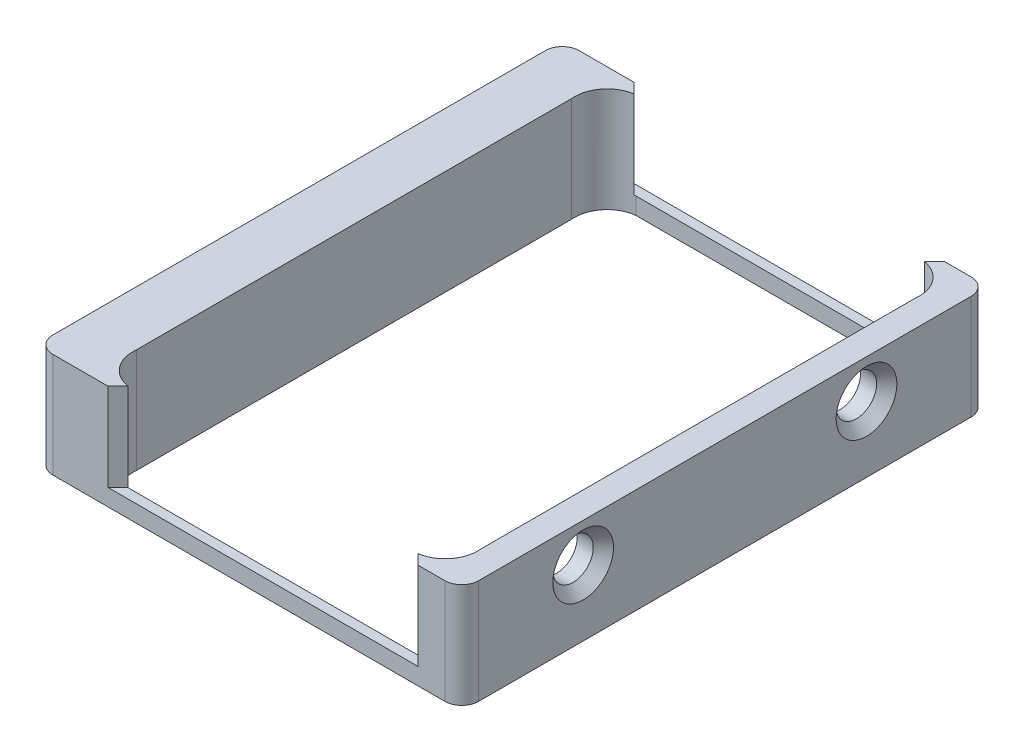
ISO-10303-21;
HEADER;
FILE_DESCRIPTION(('STEP AP214'),'2;1');
FILE_NAME('part.step','',(''),(''),'','','');
FILE_SCHEMA(('AUTOMOTIVE_DESIGN { 1 0 10303 214 1 1 1 1 }'));
ENDSEC;
DATA;
#1=APPLICATION_CONTEXT('core data for automotive mechanical design processes');
#2=APPLICATION_PROTOCOL_DEFINITION('international standard','automotive_design',2000,#1);
#3=PRODUCT_CONTEXT('',#1,'mechanical');
#4=PRODUCT('Part','Part','',(#3));
#5=PRODUCT_RELATED_PRODUCT_CATEGORY('part','',(#4));
#6=PRODUCT_DEFINITION_FORMATION('','',#4);
#7=PRODUCT_DEFINITION_CONTEXT('part definition',#1,'design');
#8=PRODUCT_DEFINITION('design','',#6,#7);
#9=PRODUCT_DEFINITION_SHAPE('','',#8);
#10=(LENGTH_UNIT() NAMED_UNIT(*) SI_UNIT(.MILLI.,.METRE.));
#11=(NAMED_UNIT(*) PLANE_ANGLE_UNIT() SI_UNIT($,.RADIAN.));
#12=(NAMED_UNIT(*) SI_UNIT($,.STERADIAN.) SOLID_ANGLE_UNIT());
#13=UNCERTAINTY_MEASURE_WITH_UNIT(LENGTH_MEASURE(1.E-05),#10,'distance_accuracy_value','');
#14=(GEOMETRIC_REPRESENTATION_CONTEXT(3) GLOBAL_UNCERTAINTY_ASSIGNED_CONTEXT((#13)) GLOBAL_UNIT_ASSIGNED_CONTEXT((#10,
#11,#12)) REPRESENTATION_CONTEXT('',''));
#15=CARTESIAN_POINT('',(0.,0.,0.));
#16=DIRECTION('',(0.,0.,1.));
#17=DIRECTION('',(1.,0.,0.));
#18=AXIS2_PLACEMENT_3D('',#15,#16,#17);
#19=CARTESIAN_POINT('',(0.,31.,0.));
#20=DIRECTION('',(0.,1.,0.));
#21=DIRECTION('',(0.,0.,1.));
#22=AXIS2_PLACEMENT_3D('',#19,#20,#21);
#23=PLANE('',#22);
#24=DIRECTION('',(-1.,0.,0.));
#25=VECTOR('',#24,1.);
#26=CARTESIAN_POINT('',(-67.3,31.,-78.));
#27=LINE('',#26,#25);
#28=CARTESIAN_POINT('',(-46.,31.,-78.));
#29=VERTEX_POINT('',#28);
#30=CARTESIAN_POINT('',(-62.3,31.,-78.));
#31=VERTEX_POINT('',#30);
#32=EDGE_CURVE('E371',#29,#31,#27,.T.);
#33=ORIENTED_EDGE('',*,*,#32,.T.);
#34=CARTESIAN_POINT('',(-62.3,31.,-73.));
#35=DIRECTION('',(0.,1.,0.));
#36=DIRECTION('',(0.,0.,1.));
#37=AXIS2_PLACEMENT_3D('',#34,#35,#36);
#38=CIRCLE('',#37,5.);
#39=CARTESIAN_POINT('',(-67.3,31.,-73.));
#40=VERTEX_POINT('',#39);
#41=EDGE_CURVE('E446',#31,#40,#38,.T.);
#42=ORIENTED_EDGE('',*,*,#41,.T.);
#43=DIRECTION('',(0.,0.,1.));
#44=VECTOR('',#43,1.);
#45=CARTESIAN_POINT('',(-67.3,31.,78.));
#46=LINE('',#45,#44);
#47=CARTESIAN_POINT('',(-67.3,31.,73.));
#48=VERTEX_POINT('',#47);
#49=EDGE_CURVE('E370',#40,#48,#46,.T.);
#50=ORIENTED_EDGE('',*,*,#49,.T.);
#51=CARTESIAN_POINT('',(-62.3,31.,73.));
#52=DIRECTION('',(0.,1.,0.));
#53=DIRECTION('',(0.,0.,1.));
#54=AXIS2_PLACEMENT_3D('',#51,#52,#53);
#55=CIRCLE('',#54,5.);
#56=CARTESIAN_POINT('',(-62.3,31.,78.));
#57=VERTEX_POINT('',#56);
#58=EDGE_CURVE('E443',#48,#57,#55,.T.);
#59=ORIENTED_EDGE('',*,*,#58,.T.);
#60=DIRECTION('',(1.,0.,0.));
#61=VECTOR('',#60,1.);
#62=CARTESIAN_POINT('',(-67.3,31.,78.));
#63=LINE('',#62,#61);
#64=CARTESIAN_POINT('',(-46.,31.,78.));
#65=VERTEX_POINT('',#64);
#66=EDGE_CURVE('E376',#57,#65,#63,.T.);
#67=ORIENTED_EDGE('',*,*,#66,.T.);
#68=DIRECTION('',(0.707106781186555,0.,-0.70710678118654));
#69=VECTOR('',#68,1.);
#70=CARTESIAN_POINT('',(16.0000000000005,31.,16.0000000000008));
#71=LINE('',#70,#69);
#72=CARTESIAN_POINT('',(-43.0299186250794,31.,75.0299186250794));
#73=VERTEX_POINT('',#72);
#74=EDGE_CURVE('E219',#65,#73,#71,.T.);
#75=ORIENTED_EDGE('',*,*,#74,.T.);
#76=CARTESIAN_POINT('',(-41.5,31.,65.5));
#77=DIRECTION('',(0.,1.,0.));
#78=DIRECTION('',(0.,0.,1.));
#79=AXIS2_PLACEMENT_3D('',#76,#77,#78);
#80=CIRCLE('',#79,9.65194280961093);
#81=CARTESIAN_POINT('',(-51.1,31.,64.5));
#82=VERTEX_POINT('',#81);
#83=EDGE_CURVE('E291',#82,#73,#80,.T.);
#84=ORIENTED_EDGE('',*,*,#83,.F.);
#85=DIRECTION('',(0.,0.,1.));
#86=VECTOR('',#85,1.);
#87=CARTESIAN_POINT('',(-51.1,31.,64.5));
#88=LINE('',#87,#86);
#89=CARTESIAN_POINT('',(-51.1,31.,-64.5));
#90=VERTEX_POINT('',#89);
#91=EDGE_CURVE('E309',#90,#82,#88,.T.);
#92=ORIENTED_EDGE('',*,*,#91,.F.);
#93=CARTESIAN_POINT('',(-41.5,31.,-65.5));
#94=DIRECTION('',(0.,1.,0.));
#95=DIRECTION('',(0.,0.,-1.));
#96=AXIS2_PLACEMENT_3D('',#93,#94,#95);
#97=CIRCLE('',#96,9.65194280961091);
#98=CARTESIAN_POINT('',(-43.0299186250794,31.,-75.0299186250794));
#99=VERTEX_POINT('',#98);
#100=EDGE_CURVE('E306',#99,#90,#97,.T.);
#101=ORIENTED_EDGE('',*,*,#100,.F.);
#102=DIRECTION('',(-0.707106781186549,0.,-0.707106781186546));
#103=VECTOR('',#102,1.);
#104=CARTESIAN_POINT('',(16.0000000000001,31.,-16.0000000000002));
#105=LINE('',#104,#103);
#106=EDGE_CURVE('E261',#99,#29,#105,.T.);
#107=ORIENTED_EDGE('',*,*,#106,.T.);
#108=EDGE_LOOP('',(#33,#42,#50,#59,#67,#75,#84,#92,#101,#107));
#109=FACE_BOUND('',#108,.T.);
#110=ADVANCED_FACE('F45',(#109),#23,.T.);
#111=DIRECTION('',(0.,0.,-1.));
#112=VECTOR('',#111,1.);
#113=CARTESIAN_POINT('',(58.9,31.,78.));
#114=LINE('',#113,#112);
#115=CARTESIAN_POINT('',(58.9,31.,73.));
#116=VERTEX_POINT('',#115);
#117=CARTESIAN_POINT('',(58.9,31.,-73.));
#118=VERTEX_POINT('',#117);
#119=EDGE_CURVE('E379',#116,#118,#114,.T.);
#120=ORIENTED_EDGE('',*,*,#119,.T.);
#121=CARTESIAN_POINT('',(53.9,31.,-73.));
#122=DIRECTION('',(0.,1.,0.));
#123=DIRECTION('',(0.,0.,1.));
#124=AXIS2_PLACEMENT_3D('',#121,#122,#123);
#125=CIRCLE('',#124,5.);
#126=CARTESIAN_POINT('',(53.9,31.,-78.));
#127=VERTEX_POINT('',#126);
#128=EDGE_CURVE('E458',#118,#127,#125,.T.);
#129=ORIENTED_EDGE('',*,*,#128,.T.);
#130=CARTESIAN_POINT('',(46.,31.,-78.));
#131=VERTEX_POINT('',#130);
#132=EDGE_CURVE('E367',#127,#131,#27,.T.);
#133=ORIENTED_EDGE('',*,*,#132,.T.);
#134=DIRECTION('',(0.707106781186549,0.,-0.707106781186546));
#135=VECTOR('',#134,1.);
#136=CARTESIAN_POINT('',(-16.0000000000001,31.,-16.0000000000002));
#137=LINE('',#136,#135);
#138=CARTESIAN_POINT('',(43.0299186250794,31.,-75.0299186250794));
#139=VERTEX_POINT('',#138);
#140=EDGE_CURVE('E272',#139,#131,#137,.T.);
#141=ORIENTED_EDGE('',*,*,#140,.F.);
#142=CARTESIAN_POINT('',(41.5,31.,-65.5));
#143=DIRECTION('',(0.,1.,0.));
#144=DIRECTION('',(0.,0.,-1.));
#145=AXIS2_PLACEMENT_3D('',#142,#143,#144);
#146=CIRCLE('',#145,9.65194280961098);
#147=CARTESIAN_POINT('',(51.1,31.,-64.5));
#148=VERTEX_POINT('',#147);
#149=EDGE_CURVE('E302',#148,#139,#146,.T.);
#150=ORIENTED_EDGE('',*,*,#149,.F.);
#151=DIRECTION('',(0.,0.,-1.));
#152=VECTOR('',#151,1.);
#153=CARTESIAN_POINT('',(51.1,31.,64.5));
#154=LINE('',#153,#152);
#155=CARTESIAN_POINT('',(51.1,31.,64.5));
#156=VERTEX_POINT('',#155);
#157=EDGE_CURVE('E299',#156,#148,#154,.T.);
#158=ORIENTED_EDGE('',*,*,#157,.F.);
#159=CARTESIAN_POINT('',(41.5,31.,65.5));
#160=DIRECTION('',(0.,1.,0.));
#161=DIRECTION('',(0.,0.,1.));
#162=AXIS2_PLACEMENT_3D('',#159,#160,#161);
#163=CIRCLE('',#162,9.65194280961099);
#164=CARTESIAN_POINT('',(43.0299186250794,31.,75.0299186250794));
#165=VERTEX_POINT('',#164);
#166=EDGE_CURVE('E295',#165,#156,#163,.T.);
#167=ORIENTED_EDGE('',*,*,#166,.F.);
#168=DIRECTION('',(0.707106781186549,0.,0.707106781186546));
#169=VECTOR('',#168,1.);
#170=CARTESIAN_POINT('',(-16.0000000000001,31.,16.0000000000002));
#171=LINE('',#170,#169);
#172=CARTESIAN_POINT('',(46.,31.,78.));
#173=VERTEX_POINT('',#172);
#174=EDGE_CURVE('E234',#165,#173,#171,.T.);
#175=ORIENTED_EDGE('',*,*,#174,.T.);
#176=CARTESIAN_POINT('',(53.9,31.,78.));
#177=VERTEX_POINT('',#176);
#178=EDGE_CURVE('E375',#173,#177,#63,.T.);
#179=ORIENTED_EDGE('',*,*,#178,.T.);
#180=CARTESIAN_POINT('',(53.9,31.,73.));
#181=DIRECTION('',(0.,1.,0.));
#182=DIRECTION('',(0.,0.,1.));
#183=AXIS2_PLACEMENT_3D('',#180,#181,#182);
#184=CIRCLE('',#183,5.);
#185=EDGE_CURVE('E455',#177,#116,#184,.T.);
#186=ORIENTED_EDGE('',*,*,#185,.T.);
#187=EDGE_LOOP('',(#120,#129,#133,#141,#150,#158,#167,#175,#179,#186));
#188=FACE_BOUND('',#187,.T.);
#189=ADVANCED_FACE('F633',(#188),#23,.T.);
#190=CARTESIAN_POINT('',(-67.3,31.,-78.));
#191=DIRECTION('',(0.,0.,1.));
#192=DIRECTION('',(1.,0.,0.));
#193=AXIS2_PLACEMENT_3D('',#190,#191,#192);
#194=PLANE('',#193);
#195=DIRECTION('',(-1.,0.,0.));
#196=VECTOR('',#195,1.);
#197=CARTESIAN_POINT('',(-67.3,0.,-78.));
#198=LINE('',#197,#196);
#199=CARTESIAN_POINT('',(53.9,0.,-78.));
#200=VERTEX_POINT('',#199);
#201=CARTESIAN_POINT('',(-62.3,0.,-78.));
#202=VERTEX_POINT('',#201);
#203=EDGE_CURVE('E366',#200,#202,#198,.T.);
#204=ORIENTED_EDGE('',*,*,#203,.T.);
#205=DIRECTION('',(0.,-1.,0.));
#206=VECTOR('',#205,1.);
#207=CARTESIAN_POINT('',(-62.3,31.,-78.));
#208=LINE('',#207,#206);
#209=EDGE_CURVE('E440',#202,#31,#208,.F.);
#210=ORIENTED_EDGE('',*,*,#209,.T.);
#211=ORIENTED_EDGE('',*,*,#32,.F.);
#212=DIRECTION('',(0.,1.,0.));
#213=VECTOR('',#212,1.);
#214=CARTESIAN_POINT('',(-46.,5.,-78.));
#215=LINE('',#214,#213);
#216=CARTESIAN_POINT('',(-46.,5.,-78.));
#217=VERTEX_POINT('',#216);
#218=EDGE_CURVE('E251',#217,#29,#215,.T.);
#219=ORIENTED_EDGE('',*,*,#218,.F.);
#220=DIRECTION('',(-1.,0.,0.));
#221=VECTOR('',#220,1.);
#222=CARTESIAN_POINT('',(0.,5.,-78.));
#223=LINE('',#222,#221);
#224=CARTESIAN_POINT('',(46.,5.,-78.));
#225=VERTEX_POINT('',#224);
#226=EDGE_CURVE('E264',#225,#217,#223,.T.);
#227=ORIENTED_EDGE('',*,*,#226,.F.);
#228=DIRECTION('',(0.,1.,0.));
#229=VECTOR('',#228,1.);
#230=CARTESIAN_POINT('',(46.,5.,-78.));
#231=LINE('',#230,#229);
#232=EDGE_CURVE('E271',#225,#131,#231,.T.);
#233=ORIENTED_EDGE('',*,*,#232,.T.);
#234=ORIENTED_EDGE('',*,*,#132,.F.);
#235=DIRECTION('',(0.,-1.,0.));
#236=VECTOR('',#235,1.);
#237=CARTESIAN_POINT('',(53.9,31.,-78.));
#238=LINE('',#237,#236);
#239=EDGE_CURVE('E436',#127,#200,#238,.T.);
#240=ORIENTED_EDGE('',*,*,#239,.T.);
#241=EDGE_LOOP('',(#204,#210,#211,#219,#227,#233,#234,#240));
#242=FACE_BOUND('',#241,.T.);
#243=ADVANCED_FACE('F610',(#242),#194,.F.);
#244=CARTESIAN_POINT('',(-67.3,31.,78.));
#245=DIRECTION('',(0.,0.,-1.));
#246=DIRECTION('',(-1.,0.,0.));
#247=AXIS2_PLACEMENT_3D('',#244,#245,#246);
#248=PLANE('',#247);
#249=DIRECTION('',(1.,0.,0.));
#250=VECTOR('',#249,1.);
#251=CARTESIAN_POINT('',(-67.3,0.,78.));
#252=LINE('',#251,#250);
#253=CARTESIAN_POINT('',(-62.3,0.,78.));
#254=VERTEX_POINT('',#253);
#255=CARTESIAN_POINT('',(53.9,0.,78.));
#256=VERTEX_POINT('',#255);
#257=EDGE_CURVE('E390',#254,#256,#252,.T.);
#258=ORIENTED_EDGE('',*,*,#257,.T.);
#259=DIRECTION('',(0.,-1.,0.));
#260=VECTOR('',#259,1.);
#261=CARTESIAN_POINT('',(53.9,31.,78.));
#262=LINE('',#261,#260);
#263=EDGE_CURVE('E62',#256,#177,#262,.F.);
#264=ORIENTED_EDGE('',*,*,#263,.T.);
#265=ORIENTED_EDGE('',*,*,#178,.F.);
#266=DIRECTION('',(0.,1.,0.));
#267=VECTOR('',#266,1.);
#268=CARTESIAN_POINT('',(46.,5.,78.));
#269=LINE('',#268,#267);
#270=CARTESIAN_POINT('',(46.,5.,78.));
#271=VERTEX_POINT('',#270);
#272=EDGE_CURVE('E223',#271,#173,#269,.T.);
#273=ORIENTED_EDGE('',*,*,#272,.F.);
#274=DIRECTION('',(1.,0.,0.));
#275=VECTOR('',#274,1.);
#276=CARTESIAN_POINT('',(0.,5.,78.));
#277=LINE('',#276,#275);
#278=CARTESIAN_POINT('',(-46.,5.,78.));
#279=VERTEX_POINT('',#278);
#280=EDGE_CURVE('E229',#279,#271,#277,.T.);
#281=ORIENTED_EDGE('',*,*,#280,.F.);
#282=DIRECTION('',(0.,1.,0.));
#283=VECTOR('',#282,1.);
#284=CARTESIAN_POINT('',(-46.,5.,78.));
#285=LINE('',#284,#283);
#286=EDGE_CURVE('E213',#279,#65,#285,.T.);
#287=ORIENTED_EDGE('',*,*,#286,.T.);
#288=ORIENTED_EDGE('',*,*,#66,.F.);
#289=DIRECTION('',(0.,-1.,0.));
#290=VECTOR('',#289,1.);
#291=CARTESIAN_POINT('',(-62.3,31.,78.));
#292=LINE('',#291,#290);
#293=EDGE_CURVE('E461',#57,#254,#292,.T.);
#294=ORIENTED_EDGE('',*,*,#293,.T.);
#295=EDGE_LOOP('',(#258,#264,#265,#273,#281,#287,#288,#294));
#296=FACE_BOUND('',#295,.T.);
#297=ADVANCED_FACE('F236',(#296),#248,.F.);
#298=CARTESIAN_POINT('',(-41.5,31.,65.5));
#299=DIRECTION('',(0.,-1.,0.));
#300=DIRECTION('',(0.,0.,-1.));
#301=AXIS2_PLACEMENT_3D('',#298,#299,#300);
#302=CYLINDRICAL_SURFACE('',#301,9.65194280961093);
#303=ORIENTED_EDGE('',*,*,#83,.T.);
#304=DIRECTION('',(0.,-1.,0.));
#305=VECTOR('',#304,1.);
#306=CARTESIAN_POINT('',(-43.0299186250794,31.,75.0299186250794));
#307=LINE('',#306,#305);
#308=CARTESIAN_POINT('',(-43.0299186250794,5.,75.0299186250794));
#309=VERTEX_POINT('',#308);
#310=EDGE_CURVE('E414',#73,#309,#307,.T.);
#311=ORIENTED_EDGE('',*,*,#310,.T.);
#312=CARTESIAN_POINT('',(-41.5,5.,65.5));
#313=DIRECTION('',(0.,1.,0.));
#314=DIRECTION('',(0.,0.,1.));
#315=AXIS2_PLACEMENT_3D('',#312,#313,#314);
#316=CIRCLE('',#315,9.65194280961093);
#317=CARTESIAN_POINT('',(-42.5,5.,75.1));
#318=VERTEX_POINT('',#317);
#319=EDGE_CURVE('E232',#309,#318,#316,.T.);
#320=ORIENTED_EDGE('',*,*,#319,.T.);
#321=DIRECTION('',(0.,-1.,0.));
#322=VECTOR('',#321,1.);
#323=CARTESIAN_POINT('',(-42.5,31.,75.1));
#324=LINE('',#323,#322);
#325=CARTESIAN_POINT('',(-42.5,0.,75.1));
#326=VERTEX_POINT('',#325);
#327=EDGE_CURVE('E363',#318,#326,#324,.T.);
#328=ORIENTED_EDGE('',*,*,#327,.T.);
#329=CARTESIAN_POINT('',(-41.5,0.,65.5));
#330=DIRECTION('',(0.,1.,0.));
#331=DIRECTION('',(0.,0.,1.));
#332=AXIS2_PLACEMENT_3D('',#329,#330,#331);
#333=CIRCLE('',#332,9.65194280961093);
#334=CARTESIAN_POINT('',(-51.1,0.,64.5));
#335=VERTEX_POINT('',#334);
#336=EDGE_CURVE('E290',#335,#326,#333,.T.);
#337=ORIENTED_EDGE('',*,*,#336,.F.);
#338=DIRECTION('',(0.,-1.,0.));
#339=VECTOR('',#338,1.);
#340=CARTESIAN_POINT('',(-51.1,31.,64.5));
#341=LINE('',#340,#339);
#342=EDGE_CURVE('E311',#82,#335,#341,.T.);
#343=ORIENTED_EDGE('',*,*,#342,.F.);
#344=EDGE_LOOP('',(#303,#311,#320,#328,#337,#343));
#345=FACE_BOUND('',#344,.T.);
#346=ADVANCED_FACE('F568',(#345),#302,.F.);
#347=CARTESIAN_POINT('',(-42.5,31.,75.1));
#348=DIRECTION('',(0.,0.,-1.));
#349=DIRECTION('',(-1.,0.,0.));
#350=AXIS2_PLACEMENT_3D('',#347,#348,#349);
#351=PLANE('',#350);
#352=ORIENTED_EDGE('',*,*,#327,.F.);
#353=DIRECTION('',(1.,0.,0.));
#354=VECTOR('',#353,1.);
#355=CARTESIAN_POINT('',(0.,5.,75.1));
#356=LINE('',#355,#354);
#357=CARTESIAN_POINT('',(42.5,5.,75.1));
#358=VERTEX_POINT('',#357);
#359=EDGE_CURVE('E224',#318,#358,#356,.T.);
#360=ORIENTED_EDGE('',*,*,#359,.T.);
#361=DIRECTION('',(0.,-1.,0.));
#362=VECTOR('',#361,1.);
#363=CARTESIAN_POINT('',(42.5,31.,75.1));
#364=LINE('',#363,#362);
#365=CARTESIAN_POINT('',(42.5,0.,75.1));
#366=VERTEX_POINT('',#365);
#367=EDGE_CURVE('E360',#358,#366,#364,.T.);
#368=ORIENTED_EDGE('',*,*,#367,.T.);
#369=DIRECTION('',(1.,0.,0.));
#370=VECTOR('',#369,1.);
#371=CARTESIAN_POINT('',(-42.5,0.,75.1));
#372=LINE('',#371,#370);
#373=EDGE_CURVE('E315',#326,#366,#372,.T.);
#374=ORIENTED_EDGE('',*,*,#373,.F.);
#375=EDGE_LOOP('',(#352,#360,#368,#374));
#376=FACE_BOUND('',#375,.T.);
#377=ADVANCED_FACE('F579',(#376),#351,.T.);
#378=CARTESIAN_POINT('',(41.5,31.,65.5));
#379=DIRECTION('',(0.,-1.,0.));
#380=DIRECTION('',(0.,0.,-1.));
#381=AXIS2_PLACEMENT_3D('',#378,#379,#380);
#382=CYLINDRICAL_SURFACE('',#381,9.65194280961099);
#383=CARTESIAN_POINT('',(41.5,5.,65.5));
#384=DIRECTION('',(0.,1.,0.));
#385=DIRECTION('',(0.,0.,1.));
#386=AXIS2_PLACEMENT_3D('',#383,#384,#385);
#387=CIRCLE('',#386,9.65194280961099);
#388=CARTESIAN_POINT('',(43.0299186250794,5.,75.0299186250794));
#389=VERTEX_POINT('',#388);
#390=EDGE_CURVE('E406',#358,#389,#387,.T.);
#391=ORIENTED_EDGE('',*,*,#390,.T.);
#392=DIRECTION('',(0.,-1.,0.));
#393=VECTOR('',#392,1.);
#394=CARTESIAN_POINT('',(43.0299186250794,31.,75.0299186250794));
#395=LINE('',#394,#393);
#396=EDGE_CURVE('E410',#389,#165,#395,.F.);
#397=ORIENTED_EDGE('',*,*,#396,.T.);
#398=ORIENTED_EDGE('',*,*,#166,.T.);
#399=DIRECTION('',(0.,-1.,0.));
#400=VECTOR('',#399,1.);
#401=CARTESIAN_POINT('',(51.1,31.,64.5));
#402=LINE('',#401,#400);
#403=CARTESIAN_POINT('',(51.1,0.,64.5));
#404=VERTEX_POINT('',#403);
#405=EDGE_CURVE('E357',#156,#404,#402,.T.);
#406=ORIENTED_EDGE('',*,*,#405,.T.);
#407=CARTESIAN_POINT('',(41.5,0.,65.5));
#408=DIRECTION('',(0.,1.,0.));
#409=DIRECTION('',(0.,0.,1.));
#410=AXIS2_PLACEMENT_3D('',#407,#408,#409);
#411=CIRCLE('',#410,9.65194280961099);
#412=EDGE_CURVE('E319',#366,#404,#411,.T.);
#413=ORIENTED_EDGE('',*,*,#412,.F.);
#414=ORIENTED_EDGE('',*,*,#367,.F.);
#415=EDGE_LOOP('',(#391,#397,#398,#406,#413,#414));
#416=FACE_BOUND('',#415,.T.);
#417=ADVANCED_FACE('F583',(#416),#382,.F.);
#418=CARTESIAN_POINT('',(-42.5,31.,-75.1));
#419=DIRECTION('',(0.,0.,1.));
#420=DIRECTION('',(1.,0.,0.));
#421=AXIS2_PLACEMENT_3D('',#418,#419,#420);
#422=PLANE('',#421);
#423=DIRECTION('',(0.,-1.,0.));
#424=VECTOR('',#423,1.);
#425=CARTESIAN_POINT('',(42.5,31.,-75.1));
#426=LINE('',#425,#424);
#427=CARTESIAN_POINT('',(42.5,5.,-75.1));
#428=VERTEX_POINT('',#427);
#429=CARTESIAN_POINT('',(42.5,0.,-75.1));
#430=VERTEX_POINT('',#429);
#431=EDGE_CURVE('E351',#428,#430,#426,.T.);
#432=ORIENTED_EDGE('',*,*,#431,.F.);
#433=DIRECTION('',(1.,0.,0.));
#434=VECTOR('',#433,1.);
#435=CARTESIAN_POINT('',(0.,5.,-75.1));
#436=LINE('',#435,#434);
#437=CARTESIAN_POINT('',(-42.5,5.,-75.1));
#438=VERTEX_POINT('',#437);
#439=EDGE_CURVE('E258',#438,#428,#436,.T.);
#440=ORIENTED_EDGE('',*,*,#439,.F.);
#441=DIRECTION('',(0.,-1.,0.));
#442=VECTOR('',#441,1.);
#443=CARTESIAN_POINT('',(-42.5,31.,-75.1));
#444=LINE('',#443,#442);
#445=CARTESIAN_POINT('',(-42.5,0.,-75.1));
#446=VERTEX_POINT('',#445);
#447=EDGE_CURVE('E348',#438,#446,#444,.T.);
#448=ORIENTED_EDGE('',*,*,#447,.T.);
#449=DIRECTION('',(-1.,0.,0.));
#450=VECTOR('',#449,1.);
#451=CARTESIAN_POINT('',(-42.5,0.,-75.1));
#452=LINE('',#451,#450);
#453=EDGE_CURVE('E331',#430,#446,#452,.T.);
#454=ORIENTED_EDGE('',*,*,#453,.F.);
#455=EDGE_LOOP('',(#432,#440,#448,#454));
#456=FACE_BOUND('',#455,.T.);
#457=ADVANCED_FACE('F599',(#456),#422,.T.);
#458=CARTESIAN_POINT('',(-41.5,31.,-65.5));
#459=DIRECTION('',(0.,-1.,0.));
#460=DIRECTION('',(0.,0.,-1.));
#461=AXIS2_PLACEMENT_3D('',#458,#459,#460);
#462=CYLINDRICAL_SURFACE('',#461,9.65194280961091);
#463=CARTESIAN_POINT('',(-41.5,5.,-65.5));
#464=DIRECTION('',(0.,1.,0.));
#465=DIRECTION('',(0.,0.,1.));
#466=AXIS2_PLACEMENT_3D('',#463,#464,#465);
#467=CIRCLE('',#466,9.65194280961091);
#468=CARTESIAN_POINT('',(-43.0299186250794,5.,-75.0299186250794));
#469=VERTEX_POINT('',#468);
#470=EDGE_CURVE('E382',#438,#469,#467,.T.);
#471=ORIENTED_EDGE('',*,*,#470,.T.);
#472=DIRECTION('',(0.,-1.,0.));
#473=VECTOR('',#472,1.);
#474=CARTESIAN_POINT('',(-43.0299186250794,31.,-75.0299186250794));
#475=LINE('',#474,#473);
#476=EDGE_CURVE('E399',#469,#99,#475,.F.);
#477=ORIENTED_EDGE('',*,*,#476,.T.);
#478=ORIENTED_EDGE('',*,*,#100,.T.);
#479=DIRECTION('',(0.,-1.,0.));
#480=VECTOR('',#479,1.);
#481=CARTESIAN_POINT('',(-51.1,31.,-64.5));
#482=LINE('',#481,#480);
#483=CARTESIAN_POINT('',(-51.1,0.,-64.5));
#484=VERTEX_POINT('',#483);
#485=EDGE_CURVE('E345',#90,#484,#482,.T.);
#486=ORIENTED_EDGE('',*,*,#485,.T.);
#487=CARTESIAN_POINT('',(-41.5,0.,-65.5));
#488=DIRECTION('',(0.,1.,0.));
#489=DIRECTION('',(0.,0.,-1.));
#490=AXIS2_PLACEMENT_3D('',#487,#488,#489);
#491=CIRCLE('',#490,9.65194280961091);
#492=EDGE_CURVE('E335',#446,#484,#491,.T.);
#493=ORIENTED_EDGE('',*,*,#492,.F.);
#494=ORIENTED_EDGE('',*,*,#447,.F.);
#495=EDGE_LOOP('',(#471,#477,#478,#486,#493,#494));
#496=FACE_BOUND('',#495,.T.);
#497=ADVANCED_FACE('F557',(#496),#462,.F.);
#498=CARTESIAN_POINT('',(0.,0.,0.));
#499=DIRECTION('',(0.,1.,0.));
#500=DIRECTION('',(0.,0.,1.));
#501=AXIS2_PLACEMENT_3D('',#498,#499,#500);
#502=PLANE('',#501);
#503=CARTESIAN_POINT('',(53.7050082180734,0.,73.3482193616655));
#504=DIRECTION('',(0.,-1.,0.));
#505=DIRECTION('',(0.,0.,-1.));
#506=AXIS2_PLACEMENT_3D('',#503,#504,#505);
#507=CIRCLE('',#506,2.1);
#508=CARTESIAN_POINT('',(53.7050082180734,0.,71.2482193616655));
#509=VERTEX_POINT('',#508);
#510=EDGE_CURVE('E523',#509,#509,#507,.T.);
#511=ORIENTED_EDGE('',*,*,#510,.F.);
#512=EDGE_LOOP('',(#511));
#513=FACE_BOUND('',#512,.T.);
#514=CARTESIAN_POINT('',(-58.4934425788602,0.,-70.9643370582062));
#515=DIRECTION('',(0.,-1.,0.));
#516=DIRECTION('',(0.,0.,-1.));
#517=AXIS2_PLACEMENT_3D('',#514,#515,#516);
#518=CIRCLE('',#517,2.1);
#519=CARTESIAN_POINT('',(-58.4934425788602,0.,-73.0643370582062));
#520=VERTEX_POINT('',#519);
#521=EDGE_CURVE('E531',#520,#520,#518,.T.);
#522=ORIENTED_EDGE('',*,*,#521,.F.);
#523=EDGE_LOOP('',(#522));
#524=FACE_BOUND('',#523,.T.);
#525=CARTESIAN_POINT('',(53.7050082180734,0.,-73.3482193616655));
#526=DIRECTION('',(0.,-1.,0.));
#527=DIRECTION('',(0.,0.,-1.));
#528=AXIS2_PLACEMENT_3D('',#525,#526,#527);
#529=CIRCLE('',#528,2.1);
#530=CARTESIAN_POINT('',(53.7050082180734,0.,-75.4482193616655));
#531=VERTEX_POINT('',#530);
#532=EDGE_CURVE('E532',#531,#531,#529,.T.);
#533=ORIENTED_EDGE('',*,*,#532,.F.);
#534=EDGE_LOOP('',(#533));
#535=FACE_BOUND('',#534,.T.);
#536=CARTESIAN_POINT('',(-58.4934425788602,0.,70.9643370582062));
#537=DIRECTION('',(0.,-1.,0.));
#538=DIRECTION('',(0.,0.,-1.));
#539=AXIS2_PLACEMENT_3D('',#536,#537,#538);
#540=CIRCLE('',#539,2.1);
#541=CARTESIAN_POINT('',(-58.4934425788602,0.,68.8643370582062));
#542=VERTEX_POINT('',#541);
#543=EDGE_CURVE('E519',#542,#542,#540,.T.);
#544=ORIENTED_EDGE('',*,*,#543,.F.);
#545=EDGE_LOOP('',(#544));
#546=FACE_BOUND('',#545,.T.);
#547=DIRECTION('',(0.,0.,1.));
#548=VECTOR('',#547,1.);
#549=CARTESIAN_POINT('',(-67.3,0.,78.));
#550=LINE('',#549,#548);
#551=CARTESIAN_POINT('',(-67.3,0.,-73.));
#552=VERTEX_POINT('',#551);
#553=CARTESIAN_POINT('',(-67.3,0.,73.));
#554=VERTEX_POINT('',#553);
#555=EDGE_CURVE('E386',#552,#554,#550,.T.);
#556=ORIENTED_EDGE('',*,*,#555,.F.);
#557=CARTESIAN_POINT('',(-62.3,0.,-73.));
#558=DIRECTION('',(0.,1.,0.));
#559=DIRECTION('',(0.,0.,1.));
#560=AXIS2_PLACEMENT_3D('',#557,#558,#559);
#561=CIRCLE('',#560,5.);
#562=EDGE_CURVE('E433',#552,#202,#561,.F.);
#563=ORIENTED_EDGE('',*,*,#562,.T.);
#564=ORIENTED_EDGE('',*,*,#203,.F.);
#565=CARTESIAN_POINT('',(53.9,0.,-73.));
#566=DIRECTION('',(0.,1.,0.));
#567=DIRECTION('',(0.,0.,1.));
#568=AXIS2_PLACEMENT_3D('',#565,#566,#567);
#569=CIRCLE('',#568,5.);
#570=CARTESIAN_POINT('',(58.9,0.,-73.));
#571=VERTEX_POINT('',#570);
#572=EDGE_CURVE('E430',#200,#571,#569,.F.);
#573=ORIENTED_EDGE('',*,*,#572,.T.);
#574=DIRECTION('',(0.,0.,-1.));
#575=VECTOR('',#574,1.);
#576=CARTESIAN_POINT('',(58.9,0.,78.));
#577=LINE('',#576,#575);
#578=CARTESIAN_POINT('',(58.9,0.,73.));
#579=VERTEX_POINT('',#578);
#580=EDGE_CURVE('E393',#579,#571,#577,.T.);
#581=ORIENTED_EDGE('',*,*,#580,.F.);
#582=CARTESIAN_POINT('',(53.9,0.,73.));
#583=DIRECTION('',(0.,1.,0.));
#584=DIRECTION('',(0.,0.,1.));
#585=AXIS2_PLACEMENT_3D('',#582,#583,#584);
#586=CIRCLE('',#585,5.);
#587=EDGE_CURVE('E427',#579,#256,#586,.F.);
#588=ORIENTED_EDGE('',*,*,#587,.T.);
#589=ORIENTED_EDGE('',*,*,#257,.F.);
#590=CARTESIAN_POINT('',(-62.3,0.,73.));
#591=DIRECTION('',(0.,1.,0.));
#592=DIRECTION('',(0.,0.,1.));
#593=AXIS2_PLACEMENT_3D('',#590,#591,#592);
#594=CIRCLE('',#593,5.);
#595=EDGE_CURVE('E424',#254,#554,#594,.F.);
#596=ORIENTED_EDGE('',*,*,#595,.T.);
#597=EDGE_LOOP('',(#556,#563,#564,#573,#581,#588,#589,#596));
#598=FACE_BOUND('',#597,.T.);
#599=ORIENTED_EDGE('',*,*,#336,.T.);
#600=ORIENTED_EDGE('',*,*,#373,.T.);
#601=ORIENTED_EDGE('',*,*,#412,.T.);
#602=DIRECTION('',(0.,0.,-1.));
#603=VECTOR('',#602,1.);
#604=CARTESIAN_POINT('',(51.1,0.,64.5));
#605=LINE('',#604,#603);
#606=CARTESIAN_POINT('',(51.1,0.,-64.5));
#607=VERTEX_POINT('',#606);
#608=EDGE_CURVE('E323',#404,#607,#605,.T.);
#609=ORIENTED_EDGE('',*,*,#608,.T.);
#610=CARTESIAN_POINT('',(41.5,0.,-65.5));
#611=DIRECTION('',(0.,1.,0.));
#612=DIRECTION('',(0.,0.,-1.));
#613=AXIS2_PLACEMENT_3D('',#610,#611,#612);
#614=CIRCLE('',#613,9.65194280961098);
#615=EDGE_CURVE('E327',#607,#430,#614,.T.);
#616=ORIENTED_EDGE('',*,*,#615,.T.);
#617=ORIENTED_EDGE('',*,*,#453,.T.);
#618=ORIENTED_EDGE('',*,*,#492,.T.);
#619=DIRECTION('',(0.,0.,1.));
#620=VECTOR('',#619,1.);
#621=CARTESIAN_POINT('',(-51.1,0.,64.5));
#622=LINE('',#621,#620);
#623=EDGE_CURVE('E296',#484,#335,#622,.T.);
#624=ORIENTED_EDGE('',*,*,#623,.T.);
#625=EDGE_LOOP('',(#599,#600,#601,#609,#616,#617,#618,#624));
#626=FACE_BOUND('',#625,.T.);
#627=ADVANCED_FACE('F553',(#513,#524,#535,#546,#598,#626),#502,.F.);
#628=CARTESIAN_POINT('',(-67.3,31.,78.));
#629=DIRECTION('',(1.,0.,0.));
#630=DIRECTION('',(0.,0.,-1.));
#631=AXIS2_PLACEMENT_3D('',#628,#629,#630);
#632=PLANE('',#631);
#633=CARTESIAN_POINT('',(-67.3,13.95,-11.));
#634=DIRECTION('',(-1.,0.,0.));
#635=DIRECTION('',(0.,0.,1.));
#636=AXIS2_PLACEMENT_3D('',#633,#634,#635);
#637=CIRCLE('',#636,2.1);
#638=CARTESIAN_POINT('',(-67.3,13.95,-8.9));
#639=VERTEX_POINT('',#638);
#640=EDGE_CURVE('E504',#639,#639,#637,.T.);
#641=ORIENTED_EDGE('',*,*,#640,.F.);
#642=EDGE_LOOP('',(#641));
#643=FACE_BOUND('',#642,.T.);
#644=CARTESIAN_POINT('',(-67.3,13.95,11.));
#645=DIRECTION('',(-1.,0.,0.));
#646=DIRECTION('',(0.,0.,-1.));
#647=AXIS2_PLACEMENT_3D('',#644,#645,#646);
#648=CIRCLE('',#647,2.1);
#649=CARTESIAN_POINT('',(-67.3,13.95,8.9));
#650=VERTEX_POINT('',#649);
#651=EDGE_CURVE('E511',#650,#650,#648,.T.);
#652=ORIENTED_EDGE('',*,*,#651,.F.);
#653=EDGE_LOOP('',(#652));
#654=FACE_BOUND('',#653,.T.);
#655=ORIENTED_EDGE('',*,*,#49,.F.);
#656=DIRECTION('',(0.,-1.,0.));
#657=VECTOR('',#656,1.);
#658=CARTESIAN_POINT('',(-67.3,31.,-73.));
#659=LINE('',#658,#657);
#660=EDGE_CURVE('E420',#40,#552,#659,.T.);
#661=ORIENTED_EDGE('',*,*,#660,.T.);
#662=ORIENTED_EDGE('',*,*,#555,.T.);
#663=DIRECTION('',(0.,-1.,0.));
#664=VECTOR('',#663,1.);
#665=CARTESIAN_POINT('',(-67.3,31.,73.));
#666=LINE('',#665,#664);
#667=EDGE_CURVE('E417',#554,#48,#666,.F.);
#668=ORIENTED_EDGE('',*,*,#667,.T.);
#669=EDGE_LOOP('',(#655,#661,#662,#668));
#670=FACE_BOUND('',#669,.T.);
#671=ADVANCED_FACE('F556',(#643,#654,#670),#632,.F.);
#672=CARTESIAN_POINT('',(58.9,31.,78.));
#673=DIRECTION('',(-1.,0.,0.));
#674=DIRECTION('',(0.,0.,1.));
#675=AXIS2_PLACEMENT_3D('',#672,#673,#674);
#676=PLANE('',#675);
#677=CARTESIAN_POINT('',(58.9,19.55,-42.));
#678=DIRECTION('',(-1.,0.,0.));
#679=DIRECTION('',(0.,0.,1.));
#680=AXIS2_PLACEMENT_3D('',#677,#678,#679);
#681=CIRCLE('',#680,9.00000000000001);
#682=CARTESIAN_POINT('',(58.9,19.55,-33.));
#683=VERTEX_POINT('',#682);
#684=EDGE_CURVE('E55',#683,#683,#681,.T.);
#685=ORIENTED_EDGE('',*,*,#684,.T.);
#686=EDGE_LOOP('',(#685));
#687=FACE_BOUND('',#686,.T.);
#688=CARTESIAN_POINT('',(58.9,19.55,42.));
#689=DIRECTION('',(-1.,0.,0.));
#690=DIRECTION('',(0.,0.,1.));
#691=AXIS2_PLACEMENT_3D('',#688,#689,#690);
#692=CIRCLE('',#691,9.00000000000004);
#693=CARTESIAN_POINT('',(58.9,19.55,51.));
#694=VERTEX_POINT('',#693);
#695=EDGE_CURVE('E475',#694,#694,#692,.T.);
#696=ORIENTED_EDGE('',*,*,#695,.T.);
#697=EDGE_LOOP('',(#696));
#698=FACE_BOUND('',#697,.T.);
#699=ORIENTED_EDGE('',*,*,#580,.T.);
#700=DIRECTION('',(0.,-1.,0.));
#701=VECTOR('',#700,1.);
#702=CARTESIAN_POINT('',(58.9,31.,-73.));
#703=LINE('',#702,#701);
#704=EDGE_CURVE('E70',#571,#118,#703,.F.);
#705=ORIENTED_EDGE('',*,*,#704,.T.);
#706=ORIENTED_EDGE('',*,*,#119,.F.);
#707=DIRECTION('',(0.,-1.,0.));
#708=VECTOR('',#707,1.);
#709=CARTESIAN_POINT('',(58.9,31.,73.));
#710=LINE('',#709,#708);
#711=EDGE_CURVE('E449',#116,#579,#710,.T.);
#712=ORIENTED_EDGE('',*,*,#711,.T.);
#713=EDGE_LOOP('',(#699,#705,#706,#712));
#714=FACE_BOUND('',#713,.T.);
#715=ADVANCED_FACE('F482',(#687,#698,#714),#676,.F.);
#716=CARTESIAN_POINT('',(51.1,31.,64.5));
#717=DIRECTION('',(-1.,0.,0.));
#718=DIRECTION('',(0.,0.,1.));
#719=AXIS2_PLACEMENT_3D('',#716,#717,#718);
#720=PLANE('',#719);
#721=CARTESIAN_POINT('',(51.1,19.55,-42.));
#722=DIRECTION('',(-1.,0.,0.));
#723=DIRECTION('',(0.,0.,1.));
#724=AXIS2_PLACEMENT_3D('',#721,#722,#723);
#725=CIRCLE('',#724,6.);
#726=CARTESIAN_POINT('',(51.1,19.55,-36.));
#727=VERTEX_POINT('',#726);
#728=EDGE_CURVE('E471',#727,#727,#725,.T.);
#729=ORIENTED_EDGE('',*,*,#728,.F.);
#730=EDGE_LOOP('',(#729));
#731=FACE_BOUND('',#730,.T.);
#732=CARTESIAN_POINT('',(51.1,19.55,42.));
#733=DIRECTION('',(-1.,0.,0.));
#734=DIRECTION('',(0.,0.,1.));
#735=AXIS2_PLACEMENT_3D('',#732,#733,#734);
#736=CIRCLE('',#735,6.);
#737=CARTESIAN_POINT('',(51.1,19.55,48.));
#738=VERTEX_POINT('',#737);
#739=EDGE_CURVE('E276',#738,#738,#736,.T.);
#740=ORIENTED_EDGE('',*,*,#739,.F.);
#741=EDGE_LOOP('',(#740));
#742=FACE_BOUND('',#741,.T.);
#743=ORIENTED_EDGE('',*,*,#608,.F.);
#744=ORIENTED_EDGE('',*,*,#405,.F.);
#745=ORIENTED_EDGE('',*,*,#157,.T.);
#746=DIRECTION('',(0.,-1.,0.));
#747=VECTOR('',#746,1.);
#748=CARTESIAN_POINT('',(51.1,31.,-64.5));
#749=LINE('',#748,#747);
#750=EDGE_CURVE('E354',#148,#607,#749,.T.);
#751=ORIENTED_EDGE('',*,*,#750,.T.);
#752=EDGE_LOOP('',(#743,#744,#745,#751));
#753=FACE_BOUND('',#752,.T.);
#754=ADVANCED_FACE('F588',(#731,#742,#753),#720,.T.);
#755=CARTESIAN_POINT('',(41.5,31.,-65.5));
#756=DIRECTION('',(0.,-1.,0.));
#757=DIRECTION('',(0.,0.,-1.));
#758=AXIS2_PLACEMENT_3D('',#755,#756,#757);
#759=CYLINDRICAL_SURFACE('',#758,9.65194280961098);
#760=DIRECTION('',(0.,-1.,0.));
#761=VECTOR('',#760,1.);
#762=CARTESIAN_POINT('',(43.0299186250794,31.,-75.0299186250794));
#763=LINE('',#762,#761);
#764=CARTESIAN_POINT('',(43.0299186250794,5.,-75.0299186250794));
#765=VERTEX_POINT('',#764);
#766=EDGE_CURVE('E403',#765,#139,#763,.F.);
#767=ORIENTED_EDGE('',*,*,#766,.F.);
#768=CARTESIAN_POINT('',(41.5,5.,-65.5));
#769=DIRECTION('',(0.,1.,0.));
#770=DIRECTION('',(0.,0.,1.));
#771=AXIS2_PLACEMENT_3D('',#768,#769,#770);
#772=CIRCLE('',#771,9.65194280961098);
#773=EDGE_CURVE('E256',#765,#428,#772,.T.);
#774=ORIENTED_EDGE('',*,*,#773,.T.);
#775=ORIENTED_EDGE('',*,*,#431,.T.);
#776=ORIENTED_EDGE('',*,*,#615,.F.);
#777=ORIENTED_EDGE('',*,*,#750,.F.);
#778=ORIENTED_EDGE('',*,*,#149,.T.);
#779=EDGE_LOOP('',(#767,#774,#775,#776,#777,#778));
#780=FACE_BOUND('',#779,.T.);
#781=ADVANCED_FACE('F594',(#780),#759,.F.);
#782=CARTESIAN_POINT('',(-51.1,31.,64.5));
#783=DIRECTION('',(1.,0.,0.));
#784=DIRECTION('',(0.,0.,-1.));
#785=AXIS2_PLACEMENT_3D('',#782,#783,#784);
#786=PLANE('',#785);
#787=ORIENTED_EDGE('',*,*,#623,.F.);
#788=ORIENTED_EDGE('',*,*,#485,.F.);
#789=ORIENTED_EDGE('',*,*,#91,.T.);
#790=ORIENTED_EDGE('',*,*,#342,.T.);
#791=EDGE_LOOP('',(#787,#788,#789,#790));
#792=FACE_BOUND('',#791,.T.);
#793=ADVANCED_FACE('F572',(#792),#786,.T.);
#794=CARTESIAN_POINT('',(16.0000000000001,5.,-16.0000000000002));
#795=DIRECTION('',(0.707106781186546,0.,-0.707106781186549));
#796=DIRECTION('',(-0.707106781186549,0.,-0.707106781186546));
#797=AXIS2_PLACEMENT_3D('',#794,#795,#796);
#798=PLANE('',#797);
#799=DIRECTION('',(-0.707106781186549,0.,-0.707106781186546));
#800=VECTOR('',#799,1.);
#801=CARTESIAN_POINT('',(16.0000000000001,5.,-16.0000000000002));
#802=LINE('',#801,#800);
#803=EDGE_CURVE('E268',#469,#217,#802,.T.);
#804=ORIENTED_EDGE('',*,*,#803,.T.);
#805=ORIENTED_EDGE('',*,*,#218,.T.);
#806=ORIENTED_EDGE('',*,*,#106,.F.);
#807=ORIENTED_EDGE('',*,*,#476,.F.);
#808=EDGE_LOOP('',(#804,#805,#806,#807));
#809=FACE_BOUND('',#808,.T.);
#810=ADVANCED_FACE('F605',(#809),#798,.T.);
#811=CARTESIAN_POINT('',(-16.0000000000001,5.,-16.0000000000002));
#812=DIRECTION('',(0.707106781186546,0.,0.707106781186549));
#813=DIRECTION('',(0.707106781186549,0.,-0.707106781186546));
#814=AXIS2_PLACEMENT_3D('',#811,#812,#813);
#815=PLANE('',#814);
#816=ORIENTED_EDGE('',*,*,#766,.T.);
#817=ORIENTED_EDGE('',*,*,#140,.T.);
#818=ORIENTED_EDGE('',*,*,#232,.F.);
#819=DIRECTION('',(0.707106781186549,0.,-0.707106781186546));
#820=VECTOR('',#819,1.);
#821=CARTESIAN_POINT('',(-16.0000000000001,5.,-16.0000000000002));
#822=LINE('',#821,#820);
#823=EDGE_CURVE('E260',#765,#225,#822,.T.);
#824=ORIENTED_EDGE('',*,*,#823,.F.);
#825=EDGE_LOOP('',(#816,#817,#818,#824));
#826=FACE_BOUND('',#825,.T.);
#827=ADVANCED_FACE('F641',(#826),#815,.F.);
#828=CARTESIAN_POINT('',(0.,5.,0.));
#829=DIRECTION('',(0.,1.,0.));
#830=DIRECTION('',(0.,0.,1.));
#831=AXIS2_PLACEMENT_3D('',#828,#829,#830);
#832=PLANE('',#831);
#833=ORIENTED_EDGE('',*,*,#823,.T.);
#834=ORIENTED_EDGE('',*,*,#226,.T.);
#835=ORIENTED_EDGE('',*,*,#803,.F.);
#836=ORIENTED_EDGE('',*,*,#470,.F.);
#837=ORIENTED_EDGE('',*,*,#439,.T.);
#838=ORIENTED_EDGE('',*,*,#773,.F.);
#839=EDGE_LOOP('',(#833,#834,#835,#836,#837,#838));
#840=FACE_BOUND('',#839,.T.);
#841=ADVANCED_FACE('F653',(#840),#832,.T.);
#842=CARTESIAN_POINT('',(16.0000000000005,5.,16.0000000000008));
#843=DIRECTION('',(0.70710678118654,0.,0.707106781186555));
#844=DIRECTION('',(0.707106781186555,0.,-0.70710678118654));
#845=AXIS2_PLACEMENT_3D('',#842,#843,#844);
#846=PLANE('',#845);
#847=ORIENTED_EDGE('',*,*,#74,.F.);
#848=ORIENTED_EDGE('',*,*,#286,.F.);
#849=DIRECTION('',(0.707106781186555,0.,-0.70710678118654));
#850=VECTOR('',#849,1.);
#851=CARTESIAN_POINT('',(16.0000000000005,5.,16.0000000000008));
#852=LINE('',#851,#850);
#853=EDGE_CURVE('E216',#279,#309,#852,.T.);
#854=ORIENTED_EDGE('',*,*,#853,.T.);
#855=ORIENTED_EDGE('',*,*,#310,.F.);
#856=EDGE_LOOP('',(#847,#848,#854,#855));
#857=FACE_BOUND('',#856,.T.);
#858=ADVANCED_FACE('F215',(#857),#846,.T.);
#859=CARTESIAN_POINT('',(-16.0000000000001,5.,16.0000000000002));
#860=DIRECTION('',(-0.707106781186546,0.,0.707106781186549));
#861=DIRECTION('',(0.707106781186549,0.,0.707106781186546));
#862=AXIS2_PLACEMENT_3D('',#859,#860,#861);
#863=PLANE('',#862);
#864=DIRECTION('',(0.707106781186549,0.,0.707106781186546));
#865=VECTOR('',#864,1.);
#866=CARTESIAN_POINT('',(-16.0000000000001,5.,16.0000000000002));
#867=LINE('',#866,#865);
#868=EDGE_CURVE('E238',#389,#271,#867,.T.);
#869=ORIENTED_EDGE('',*,*,#868,.T.);
#870=ORIENTED_EDGE('',*,*,#272,.T.);
#871=ORIENTED_EDGE('',*,*,#174,.F.);
#872=ORIENTED_EDGE('',*,*,#396,.F.);
#873=EDGE_LOOP('',(#869,#870,#871,#872));
#874=FACE_BOUND('',#873,.T.);
#875=ADVANCED_FACE('F646',(#874),#863,.T.);
#876=CARTESIAN_POINT('',(0.,5.,0.));
#877=DIRECTION('',(0.,1.,0.));
#878=DIRECTION('',(0.,0.,1.));
#879=AXIS2_PLACEMENT_3D('',#876,#877,#878);
#880=PLANE('',#879);
#881=ORIENTED_EDGE('',*,*,#853,.F.);
#882=ORIENTED_EDGE('',*,*,#280,.T.);
#883=ORIENTED_EDGE('',*,*,#868,.F.);
#884=ORIENTED_EDGE('',*,*,#390,.F.);
#885=ORIENTED_EDGE('',*,*,#359,.F.);
#886=ORIENTED_EDGE('',*,*,#319,.F.);
#887=EDGE_LOOP('',(#881,#882,#883,#884,#885,#886));
#888=FACE_BOUND('',#887,.T.);
#889=ADVANCED_FACE('F228',(#888),#880,.T.);
#890=CARTESIAN_POINT('',(-62.3,31.,-73.));
#891=DIRECTION('',(0.,-1.,0.));
#892=DIRECTION('',(0.,0.,-1.));
#893=AXIS2_PLACEMENT_3D('',#890,#891,#892);
#894=CYLINDRICAL_SURFACE('',#893,5.);
#895=ORIENTED_EDGE('',*,*,#41,.F.);
#896=ORIENTED_EDGE('',*,*,#209,.F.);
#897=ORIENTED_EDGE('',*,*,#562,.F.);
#898=ORIENTED_EDGE('',*,*,#660,.F.);
#899=EDGE_LOOP('',(#895,#896,#897,#898));
#900=FACE_BOUND('',#899,.T.);
#901=ADVANCED_FACE('F616',(#900),#894,.T.);
#902=CARTESIAN_POINT('',(53.9,31.,-73.));
#903=DIRECTION('',(0.,-1.,0.));
#904=DIRECTION('',(0.,0.,-1.));
#905=AXIS2_PLACEMENT_3D('',#902,#903,#904);
#906=CYLINDRICAL_SURFACE('',#905,5.);
#907=ORIENTED_EDGE('',*,*,#128,.F.);
#908=ORIENTED_EDGE('',*,*,#704,.F.);
#909=ORIENTED_EDGE('',*,*,#572,.F.);
#910=ORIENTED_EDGE('',*,*,#239,.F.);
#911=EDGE_LOOP('',(#907,#908,#909,#910));
#912=FACE_BOUND('',#911,.T.);
#913=ADVANCED_FACE('F637',(#912),#906,.T.);
#914=CARTESIAN_POINT('',(53.9,31.,73.));
#915=DIRECTION('',(0.,-1.,0.));
#916=DIRECTION('',(0.,0.,-1.));
#917=AXIS2_PLACEMENT_3D('',#914,#915,#916);
#918=CYLINDRICAL_SURFACE('',#917,5.);
#919=ORIENTED_EDGE('',*,*,#185,.F.);
#920=ORIENTED_EDGE('',*,*,#263,.F.);
#921=ORIENTED_EDGE('',*,*,#587,.F.);
#922=ORIENTED_EDGE('',*,*,#711,.F.);
#923=EDGE_LOOP('',(#919,#920,#921,#922));
#924=FACE_BOUND('',#923,.T.);
#925=ADVANCED_FACE('F630',(#924),#918,.T.);
#926=CARTESIAN_POINT('',(-62.3,31.,73.));
#927=DIRECTION('',(0.,-1.,0.));
#928=DIRECTION('',(0.,0.,-1.));
#929=AXIS2_PLACEMENT_3D('',#926,#927,#928);
#930=CYLINDRICAL_SURFACE('',#929,5.);
#931=ORIENTED_EDGE('',*,*,#58,.F.);
#932=ORIENTED_EDGE('',*,*,#667,.F.);
#933=ORIENTED_EDGE('',*,*,#595,.F.);
#934=ORIENTED_EDGE('',*,*,#293,.F.);
#935=EDGE_LOOP('',(#931,#932,#933,#934));
#936=FACE_BOUND('',#935,.T.);
#937=ADVANCED_FACE('F623',(#936),#930,.T.);
#938=CARTESIAN_POINT('',(58.9,19.55,42.));
#939=DIRECTION('',(1.,0.,0.));
#940=DIRECTION('',(0.,0.,-1.));
#941=AXIS2_PLACEMENT_3D('',#938,#939,#940);
#942=CYLINDRICAL_SURFACE('',#941,6.);
#943=CARTESIAN_POINT('',(55.9,19.55,42.));
#944=DIRECTION('',(-1.,0.,0.));
#945=DIRECTION('',(0.,0.,1.));
#946=AXIS2_PLACEMENT_3D('',#943,#944,#945);
#947=CIRCLE('',#946,6.);
#948=CARTESIAN_POINT('',(55.9,19.55,48.));
#949=VERTEX_POINT('',#948);
#950=EDGE_CURVE('E11',#949,#949,#947,.F.);
#951=ORIENTED_EDGE('',*,*,#950,.T.);
#952=EDGE_LOOP('',(#951));
#953=FACE_BOUND('',#952,.T.);
#954=ORIENTED_EDGE('',*,*,#739,.T.);
#955=EDGE_LOOP('',(#954));
#956=FACE_BOUND('',#955,.T.);
#957=ADVANCED_FACE('F495',(#953,#956),#942,.F.);
#958=CARTESIAN_POINT('',(58.9,19.55,-42.));
#959=DIRECTION('',(1.,0.,0.));
#960=DIRECTION('',(0.,0.,-1.));
#961=AXIS2_PLACEMENT_3D('',#958,#959,#960);
#962=CYLINDRICAL_SURFACE('',#961,6.);
#963=CARTESIAN_POINT('',(55.9,19.55,-42.));
#964=DIRECTION('',(-1.,0.,0.));
#965=DIRECTION('',(0.,0.,1.));
#966=AXIS2_PLACEMENT_3D('',#963,#964,#965);
#967=CIRCLE('',#966,6.);
#968=CARTESIAN_POINT('',(55.9,19.55,-36.));
#969=VERTEX_POINT('',#968);
#970=EDGE_CURVE('E467',#969,#969,#967,.F.);
#971=ORIENTED_EDGE('',*,*,#970,.T.);
#972=EDGE_LOOP('',(#971));
#973=FACE_BOUND('',#972,.T.);
#974=ORIENTED_EDGE('',*,*,#728,.T.);
#975=EDGE_LOOP('',(#974));
#976=FACE_BOUND('',#975,.T.);
#977=ADVANCED_FACE('F491',(#973,#976),#962,.F.);
#978=CARTESIAN_POINT('',(-57.3,13.95,11.));
#979=DIRECTION('',(-1.,0.,0.));
#980=DIRECTION('',(0.,0.,1.));
#981=AXIS2_PLACEMENT_3D('',#978,#979,#980);
#982=CYLINDRICAL_SURFACE('',#981,2.1);
#983=CARTESIAN_POINT('',(-57.3,13.95,11.));
#984=DIRECTION('',(-1.,0.,0.));
#985=DIRECTION('',(0.,0.,-1.));
#986=AXIS2_PLACEMENT_3D('',#983,#984,#985);
#987=CIRCLE('',#986,2.1);
#988=CARTESIAN_POINT('',(-57.3,13.95,8.9));
#989=VERTEX_POINT('',#988);
#990=EDGE_CURVE('E507',#989,#989,#987,.T.);
#991=ORIENTED_EDGE('',*,*,#990,.F.);
#992=EDGE_LOOP('',(#991));
#993=FACE_BOUND('',#992,.T.);
#994=ORIENTED_EDGE('',*,*,#651,.T.);
#995=EDGE_LOOP('',(#994));
#996=FACE_BOUND('',#995,.T.);
#997=ADVANCED_FACE('F494',(#993,#996),#982,.F.);
#998=CARTESIAN_POINT('',(-57.3,13.95,11.));
#999=DIRECTION('',(1.,0.,0.));
#1000=DIRECTION('',(0.,0.,-1.));
#1001=AXIS2_PLACEMENT_3D('',#998,#999,#1000);
#1002=PLANE('',#1001);
#1003=ORIENTED_EDGE('',*,*,#990,.T.);
#1004=EDGE_LOOP('',(#1003));
#1005=FACE_BOUND('',#1004,.T.);
#1006=ADVANCED_FACE('F690',(#1005),#1002,.F.);
#1007=CARTESIAN_POINT('',(-57.3,13.95,-11.));
#1008=DIRECTION('',(-1.,0.,0.));
#1009=DIRECTION('',(0.,0.,1.));
#1010=AXIS2_PLACEMENT_3D('',#1007,#1008,#1009);
#1011=CYLINDRICAL_SURFACE('',#1010,2.1);
#1012=CARTESIAN_POINT('',(-57.3,13.95,-11.));
#1013=DIRECTION('',(-1.,0.,0.));
#1014=DIRECTION('',(0.,0.,1.));
#1015=AXIS2_PLACEMENT_3D('',#1012,#1013,#1014);
#1016=CIRCLE('',#1015,2.1);
#1017=CARTESIAN_POINT('',(-57.3,13.95,-8.9));
#1018=VERTEX_POINT('',#1017);
#1019=EDGE_CURVE('E501',#1018,#1018,#1016,.T.);
#1020=ORIENTED_EDGE('',*,*,#1019,.F.);
#1021=EDGE_LOOP('',(#1020));
#1022=FACE_BOUND('',#1021,.T.);
#1023=ORIENTED_EDGE('',*,*,#640,.T.);
#1024=EDGE_LOOP('',(#1023));
#1025=FACE_BOUND('',#1024,.T.);
#1026=ADVANCED_FACE('F693',(#1022,#1025),#1011,.F.);
#1027=CARTESIAN_POINT('',(-57.3,13.95,-11.));
#1028=DIRECTION('',(-1.,0.,0.));
#1029=DIRECTION('',(0.,0.,1.));
#1030=AXIS2_PLACEMENT_3D('',#1027,#1028,#1029);
#1031=PLANE('',#1030);
#1032=ORIENTED_EDGE('',*,*,#1019,.T.);
#1033=EDGE_LOOP('',(#1032));
#1034=FACE_BOUND('',#1033,.T.);
#1035=ADVANCED_FACE('F700',(#1034),#1031,.T.);
#1036=CARTESIAN_POINT('',(-58.4934425788602,10.,70.9643370582062));
#1037=DIRECTION('',(0.,-1.,0.));
#1038=DIRECTION('',(0.,0.,-1.));
#1039=AXIS2_PLACEMENT_3D('',#1036,#1037,#1038);
#1040=CYLINDRICAL_SURFACE('',#1039,2.1);
#1041=CARTESIAN_POINT('',(-58.4934425788602,10.,70.9643370582062));
#1042=DIRECTION('',(0.,-1.,0.));
#1043=DIRECTION('',(0.,0.,-1.));
#1044=AXIS2_PLACEMENT_3D('',#1041,#1042,#1043);
#1045=CIRCLE('',#1044,2.1);
#1046=CARTESIAN_POINT('',(-58.4934425788602,10.,68.8643370582062));
#1047=VERTEX_POINT('',#1046);
#1048=EDGE_CURVE('E512',#1047,#1047,#1045,.T.);
#1049=ORIENTED_EDGE('',*,*,#1048,.F.);
#1050=EDGE_LOOP('',(#1049));
#1051=FACE_BOUND('',#1050,.T.);
#1052=ORIENTED_EDGE('',*,*,#543,.T.);
#1053=EDGE_LOOP('',(#1052));
#1054=FACE_BOUND('',#1053,.T.);
#1055=ADVANCED_FACE('F704',(#1051,#1054),#1040,.F.);
#1056=CARTESIAN_POINT('',(-58.4934425788602,10.,70.9643370582062));
#1057=DIRECTION('',(0.,-1.,0.));
#1058=DIRECTION('',(0.,0.,-1.));
#1059=AXIS2_PLACEMENT_3D('',#1056,#1057,#1058);
#1060=PLANE('',#1059);
#1061=ORIENTED_EDGE('',*,*,#1048,.T.);
#1062=EDGE_LOOP('',(#1061));
#1063=FACE_BOUND('',#1062,.T.);
#1064=ADVANCED_FACE('F708',(#1063),#1060,.T.);
#1065=CARTESIAN_POINT('',(53.7050082180734,10.,-73.3482193616655));
#1066=DIRECTION('',(0.,-1.,0.));
#1067=DIRECTION('',(0.,0.,-1.));
#1068=AXIS2_PLACEMENT_3D('',#1065,#1066,#1067);
#1069=CYLINDRICAL_SURFACE('',#1068,2.1);
#1070=CARTESIAN_POINT('',(53.7050082180734,10.,-73.3482193616655));
#1071=DIRECTION('',(0.,-1.,0.));
#1072=DIRECTION('',(0.,0.,-1.));
#1073=AXIS2_PLACEMENT_3D('',#1070,#1071,#1072);
#1074=CIRCLE('',#1073,2.1);
#1075=CARTESIAN_POINT('',(53.7050082180734,10.,-75.4482193616655));
#1076=VERTEX_POINT('',#1075);
#1077=EDGE_CURVE('E543',#1076,#1076,#1074,.T.);
#1078=ORIENTED_EDGE('',*,*,#1077,.F.);
#1079=EDGE_LOOP('',(#1078));
#1080=FACE_BOUND('',#1079,.T.);
#1081=ORIENTED_EDGE('',*,*,#532,.T.);
#1082=EDGE_LOOP('',(#1081));
#1083=FACE_BOUND('',#1082,.T.);
#1084=ADVANCED_FACE('F551',(#1080,#1083),#1069,.F.);
#1085=CARTESIAN_POINT('',(53.7050082180734,10.,-73.3482193616655));
#1086=DIRECTION('',(0.,-1.,0.));
#1087=DIRECTION('',(0.,0.,-1.));
#1088=AXIS2_PLACEMENT_3D('',#1085,#1086,#1087);
#1089=PLANE('',#1088);
#1090=ORIENTED_EDGE('',*,*,#1077,.T.);
#1091=EDGE_LOOP('',(#1090));
#1092=FACE_BOUND('',#1091,.T.);
#1093=ADVANCED_FACE('F721',(#1092),#1089,.T.);
#1094=CARTESIAN_POINT('',(-58.4934425788602,10.,-70.9643370582062));
#1095=DIRECTION('',(0.,-1.,0.));
#1096=DIRECTION('',(0.,0.,-1.));
#1097=AXIS2_PLACEMENT_3D('',#1094,#1095,#1096);
#1098=CYLINDRICAL_SURFACE('',#1097,2.1);
#1099=CARTESIAN_POINT('',(-58.4934425788602,10.,-70.9643370582062));
#1100=DIRECTION('',(0.,-1.,0.));
#1101=DIRECTION('',(0.,0.,-1.));
#1102=AXIS2_PLACEMENT_3D('',#1099,#1100,#1101);
#1103=CIRCLE('',#1102,2.1);
#1104=CARTESIAN_POINT('',(-58.4934425788602,10.,-73.0643370582062));
#1105=VERTEX_POINT('',#1104);
#1106=EDGE_CURVE('E527',#1105,#1105,#1103,.T.);
#1107=ORIENTED_EDGE('',*,*,#1106,.F.);
#1108=EDGE_LOOP('',(#1107));
#1109=FACE_BOUND('',#1108,.T.);
#1110=ORIENTED_EDGE('',*,*,#521,.T.);
#1111=EDGE_LOOP('',(#1110));
#1112=FACE_BOUND('',#1111,.T.);
#1113=ADVANCED_FACE('F717',(#1109,#1112),#1098,.F.);
#1114=CARTESIAN_POINT('',(-58.4934425788602,10.,-70.9643370582062));
#1115=DIRECTION('',(0.,-1.,0.));
#1116=DIRECTION('',(0.,0.,-1.));
#1117=AXIS2_PLACEMENT_3D('',#1114,#1115,#1116);
#1118=PLANE('',#1117);
#1119=ORIENTED_EDGE('',*,*,#1106,.T.);
#1120=EDGE_LOOP('',(#1119));
#1121=FACE_BOUND('',#1120,.T.);
#1122=ADVANCED_FACE('F713',(#1121),#1118,.T.);
#1123=CARTESIAN_POINT('',(53.7050082180734,10.,73.3482193616655));
#1124=DIRECTION('',(0.,-1.,0.));
#1125=DIRECTION('',(0.,0.,-1.));
#1126=AXIS2_PLACEMENT_3D('',#1123,#1124,#1125);
#1127=CYLINDRICAL_SURFACE('',#1126,2.1);
#1128=CARTESIAN_POINT('',(53.7050082180734,10.,73.3482193616655));
#1129=DIRECTION('',(0.,-1.,0.));
#1130=DIRECTION('',(0.,0.,-1.));
#1131=AXIS2_PLACEMENT_3D('',#1128,#1129,#1130);
#1132=CIRCLE('',#1131,2.1);
#1133=CARTESIAN_POINT('',(53.7050082180734,10.,71.2482193616655));
#1134=VERTEX_POINT('',#1133);
#1135=EDGE_CURVE('E536',#1134,#1134,#1132,.T.);
#1136=ORIENTED_EDGE('',*,*,#1135,.F.);
#1137=EDGE_LOOP('',(#1136));
#1138=FACE_BOUND('',#1137,.T.);
#1139=ORIENTED_EDGE('',*,*,#510,.T.);
#1140=EDGE_LOOP('',(#1139));
#1141=FACE_BOUND('',#1140,.T.);
#1142=ADVANCED_FACE('F716',(#1138,#1141),#1127,.F.);
#1143=CARTESIAN_POINT('',(53.7050082180734,10.,73.3482193616655));
#1144=DIRECTION('',(0.,-1.,0.));
#1145=DIRECTION('',(0.,0.,-1.));
#1146=AXIS2_PLACEMENT_3D('',#1143,#1144,#1145);
#1147=PLANE('',#1146);
#1148=ORIENTED_EDGE('',*,*,#1135,.T.);
#1149=EDGE_LOOP('',(#1148));
#1150=FACE_BOUND('',#1149,.T.);
#1151=ADVANCED_FACE('F488',(#1150),#1147,.T.);
#1152=CARTESIAN_POINT('',(55.9,19.55,-42.));
#1153=DIRECTION('',(1.,0.,0.));
#1154=DIRECTION('',(0.,0.,-1.));
#1155=AXIS2_PLACEMENT_3D('',#1152,#1153,#1154);
#1156=CONICAL_SURFACE('',#1155,6.,0.785398163397449);
#1157=ORIENTED_EDGE('',*,*,#684,.F.);
#1158=EDGE_LOOP('',(#1157));
#1159=FACE_BOUND('',#1158,.T.);
#1160=ORIENTED_EDGE('',*,*,#970,.F.);
#1161=EDGE_LOOP('',(#1160));
#1162=FACE_BOUND('',#1161,.T.);
#1163=ADVANCED_FACE('F485',(#1159,#1162),#1156,.F.);
#1164=CARTESIAN_POINT('',(55.9,19.55,42.));
#1165=DIRECTION('',(1.,0.,0.));
#1166=DIRECTION('',(0.,0.,-1.));
#1167=AXIS2_PLACEMENT_3D('',#1164,#1165,#1166);
#1168=CONICAL_SURFACE('',#1167,6.,0.785398163397453);
#1169=ORIENTED_EDGE('',*,*,#695,.F.);
#1170=EDGE_LOOP('',(#1169));
#1171=FACE_BOUND('',#1170,.T.);
#1172=ORIENTED_EDGE('',*,*,#950,.F.);
#1173=EDGE_LOOP('',(#1172));
#1174=FACE_BOUND('',#1173,.T.);
#1175=ADVANCED_FACE('F48',(#1171,#1174),#1168,.F.);
#1176=CLOSED_SHELL('',(#110,#189,#243,#297,#346,#377,#417,#457,#497,#627,#671,#715,#754,#781,
#793,#810,#827,#841,#858,#875,#889,#901,#913,#925,#937,#957,#977,#997,#1006,#1026,#1035,#1055,
#1064,#1084,#1093,#1113,#1122,#1142,#1151,#1163,#1175));
#1177=MANIFOLD_SOLID_BREP('B2',#1176);
#1178=ADVANCED_BREP_SHAPE_REPRESENTATION('',(#18,#1177),#14);
#1179=SHAPE_DEFINITION_REPRESENTATION(#9,#1178);
ENDSEC;
END-ISO-10303-21;
